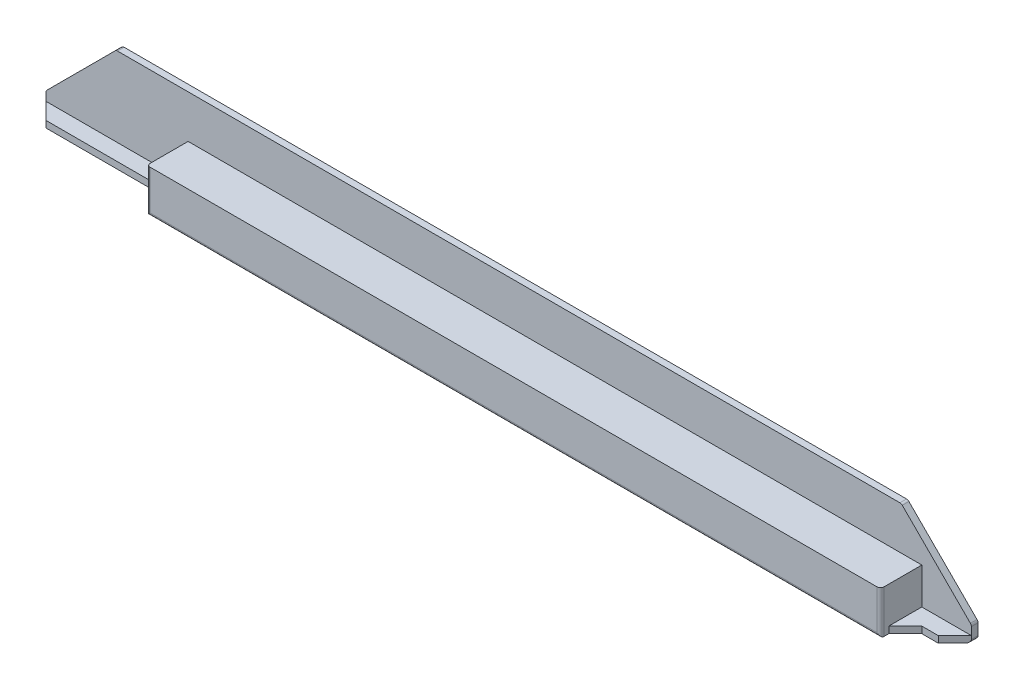
ISO-10303-21;
HEADER;
FILE_DESCRIPTION(('STEP AP214'),'2;1');
FILE_NAME('part.step','',(''),(''),'','','');
FILE_SCHEMA(('AUTOMOTIVE_DESIGN { 1 0 10303 214 1 1 1 1 }'));
ENDSEC;
DATA;
#1=APPLICATION_CONTEXT('core data for automotive mechanical design processes');
#2=APPLICATION_PROTOCOL_DEFINITION('international standard','automotive_design',2000,#1);
#3=PRODUCT_CONTEXT('',#1,'mechanical');
#4=PRODUCT('Part','Part','',(#3));
#5=PRODUCT_RELATED_PRODUCT_CATEGORY('part','',(#4));
#6=PRODUCT_DEFINITION_FORMATION('','',#4);
#7=PRODUCT_DEFINITION_CONTEXT('part definition',#1,'design');
#8=PRODUCT_DEFINITION('design','',#6,#7);
#9=PRODUCT_DEFINITION_SHAPE('','',#8);
#10=(LENGTH_UNIT() NAMED_UNIT(*) SI_UNIT(.MILLI.,.METRE.));
#11=(NAMED_UNIT(*) PLANE_ANGLE_UNIT() SI_UNIT($,.RADIAN.));
#12=(NAMED_UNIT(*) SI_UNIT($,.STERADIAN.) SOLID_ANGLE_UNIT());
#13=UNCERTAINTY_MEASURE_WITH_UNIT(LENGTH_MEASURE(1.E-05),#10,'distance_accuracy_value','');
#14=(GEOMETRIC_REPRESENTATION_CONTEXT(3) GLOBAL_UNCERTAINTY_ASSIGNED_CONTEXT((#13)) GLOBAL_UNIT_ASSIGNED_CONTEXT((#10,
#11,#12)) REPRESENTATION_CONTEXT('',''));
#15=CARTESIAN_POINT('',(0.,0.,0.));
#16=DIRECTION('',(0.,0.,1.));
#17=DIRECTION('',(1.,0.,0.));
#18=AXIS2_PLACEMENT_3D('',#15,#16,#17);
#19=CARTESIAN_POINT('',(0.,0.,2.));
#20=DIRECTION('',(0.,0.,1.));
#21=DIRECTION('',(1.,0.,0.));
#22=AXIS2_PLACEMENT_3D('',#19,#20,#21);
#23=PLANE('',#22);
#24=DIRECTION('',(-0.70710678118655,0.707106781186545,0.));
#25=VECTOR('',#24,1.);
#26=CARTESIAN_POINT('',(141.393398282201,141.393398282202,2.));
#27=LINE('',#26,#25);
#28=CARTESIAN_POINT('',(279.707106781187,3.07968978321713,2.));
#29=VERTEX_POINT('',#28);
#30=CARTESIAN_POINT('',(259.079689783217,23.7071067811865,2.));
#31=VERTEX_POINT('',#30);
#32=EDGE_CURVE('E268',#29,#31,#27,.T.);
#33=ORIENTED_EDGE('',*,*,#32,.T.);
#34=CARTESIAN_POINT('',(258.37258300203,23.,2.));
#35=DIRECTION('',(0.,0.,1.));
#36=DIRECTION('',(1.,0.,0.));
#37=AXIS2_PLACEMENT_3D('',#34,#35,#36);
#38=CIRCLE('',#37,1.);
#39=CARTESIAN_POINT('',(258.37258300203,24.,2.));
#40=VERTEX_POINT('',#39);
#41=EDGE_CURVE('E412',#31,#40,#38,.T.);
#42=ORIENTED_EDGE('',*,*,#41,.T.);
#43=DIRECTION('',(1.,0.,0.));
#44=VECTOR('',#43,1.);
#45=CARTESIAN_POINT('',(0.,24.,2.));
#46=LINE('',#45,#44);
#47=CARTESIAN_POINT('',(21.6274169979695,24.,2.));
#48=VERTEX_POINT('',#47);
#49=EDGE_CURVE('E271',#48,#40,#46,.T.);
#50=ORIENTED_EDGE('',*,*,#49,.F.);
#51=CARTESIAN_POINT('',(21.6274169979695,23.,2.));
#52=DIRECTION('',(0.,0.,1.));
#53=DIRECTION('',(1.,0.,0.));
#54=AXIS2_PLACEMENT_3D('',#51,#52,#53);
#55=CIRCLE('',#54,1.);
#56=CARTESIAN_POINT('',(20.920310216783,23.7071067811865,2.));
#57=VERTEX_POINT('',#56);
#58=EDGE_CURVE('E404',#48,#57,#55,.T.);
#59=ORIENTED_EDGE('',*,*,#58,.T.);
#60=DIRECTION('',(0.707106781186549,0.707106781186546,0.));
#61=VECTOR('',#60,1.);
#62=CARTESIAN_POINT('',(-1.39339828220181,1.39339828220181,2.));
#63=LINE('',#62,#61);
#64=CARTESIAN_POINT('',(0.292893218813454,3.07968978321706,2.));
#65=VERTEX_POINT('',#64);
#66=EDGE_CURVE('E275',#65,#57,#63,.T.);
#67=ORIENTED_EDGE('',*,*,#66,.F.);
#68=CARTESIAN_POINT('',(1.,2.37258300203052,2.));
#69=DIRECTION('',(0.,0.,1.));
#70=DIRECTION('',(1.,0.,0.));
#71=AXIS2_PLACEMENT_3D('',#68,#69,#70);
#72=CIRCLE('',#71,1.);
#73=CARTESIAN_POINT('',(0.,2.37258300203052,2.));
#74=VERTEX_POINT('',#73);
#75=EDGE_CURVE('E251',#65,#74,#72,.T.);
#76=ORIENTED_EDGE('',*,*,#75,.T.);
#77=DIRECTION('',(0.,1.,0.));
#78=VECTOR('',#77,1.);
#79=CARTESIAN_POINT('',(0.,0.,2.));
#80=LINE('',#79,#78);
#81=CARTESIAN_POINT('',(0.,0.,2.));
#82=VERTEX_POINT('',#81);
#83=EDGE_CURVE('E217',#82,#74,#80,.T.);
#84=ORIENTED_EDGE('',*,*,#83,.F.);
#85=DIRECTION('',(1.,0.,0.));
#86=VECTOR('',#85,1.);
#87=CARTESIAN_POINT('',(0.,0.,2.));
#88=LINE('',#87,#86);
#89=CARTESIAN_POINT('',(43.,0.,2.));
#90=VERTEX_POINT('',#89);
#91=EDGE_CURVE('E237',#82,#90,#88,.T.);
#92=ORIENTED_EDGE('',*,*,#91,.T.);
#93=DIRECTION('',(0.,-1.,0.));
#94=VECTOR('',#93,1.);
#95=CARTESIAN_POINT('',(43.,11.,2.));
#96=LINE('',#95,#94);
#97=CARTESIAN_POINT('',(43.,11.,2.));
#98=VERTEX_POINT('',#97);
#99=EDGE_CURVE('E442',#98,#90,#96,.T.);
#100=ORIENTED_EDGE('',*,*,#99,.F.);
#101=DIRECTION('',(-1.,0.,0.));
#102=VECTOR('',#101,1.);
#103=CARTESIAN_POINT('',(43.,11.,2.));
#104=LINE('',#103,#102);
#105=CARTESIAN_POINT('',(265.,11.,2.));
#106=VERTEX_POINT('',#105);
#107=EDGE_CURVE('E452',#106,#98,#104,.T.);
#108=ORIENTED_EDGE('',*,*,#107,.F.);
#109=DIRECTION('',(0.,1.,0.));
#110=VECTOR('',#109,1.);
#111=CARTESIAN_POINT('',(265.,11.,2.));
#112=LINE('',#111,#110);
#113=CARTESIAN_POINT('',(265.,0.,2.));
#114=VERTEX_POINT('',#113);
#115=EDGE_CURVE('E447',#114,#106,#112,.T.);
#116=ORIENTED_EDGE('',*,*,#115,.F.);
#117=CARTESIAN_POINT('',(280.,0.,2.));
#118=VERTEX_POINT('',#117);
#119=EDGE_CURVE('E246',#114,#118,#88,.T.);
#120=ORIENTED_EDGE('',*,*,#119,.T.);
#121=DIRECTION('',(0.,1.,0.));
#122=VECTOR('',#121,1.);
#123=CARTESIAN_POINT('',(280.,0.,2.));
#124=LINE('',#123,#122);
#125=CARTESIAN_POINT('',(280.,2.37258300203058,2.));
#126=VERTEX_POINT('',#125);
#127=EDGE_CURVE('E245',#118,#126,#124,.T.);
#128=ORIENTED_EDGE('',*,*,#127,.T.);
#129=CARTESIAN_POINT('',(279.,2.37258300203058,2.));
#130=DIRECTION('',(0.,0.,1.));
#131=DIRECTION('',(1.,0.,0.));
#132=AXIS2_PLACEMENT_3D('',#129,#130,#131);
#133=CIRCLE('',#132,1.);
#134=EDGE_CURVE('E409',#126,#29,#133,.T.);
#135=ORIENTED_EDGE('',*,*,#134,.T.);
#136=EDGE_LOOP('',(#33,#42,#50,#59,#67,#76,#84,#92,#100,#108,#116,#120,#128,#135));
#137=FACE_BOUND('',#136,.T.);
#138=ADVANCED_FACE('F43',(#137),#23,.T.);
#139=CARTESIAN_POINT('',(0.,0.,0.));
#140=DIRECTION('',(0.,1.,0.));
#141=DIRECTION('',(0.,0.,1.));
#142=AXIS2_PLACEMENT_3D('',#139,#140,#141);
#143=PLANE('',#142);
#144=ORIENTED_EDGE('',*,*,#91,.F.);
#145=DIRECTION('',(0.707106781186548,0.,0.707106781186547));
#146=VECTOR('',#145,1.);
#147=CARTESIAN_POINT('',(-1.,0.,1.));
#148=LINE('',#147,#146);
#149=CARTESIAN_POINT('',(5.,0.,7.));
#150=VERTEX_POINT('',#149);
#151=EDGE_CURVE('E222',#82,#150,#148,.T.);
#152=ORIENTED_EDGE('',*,*,#151,.T.);
#153=DIRECTION('',(-1.,0.,0.));
#154=VECTOR('',#153,1.);
#155=CARTESIAN_POINT('',(0.,0.,7.));
#156=LINE('',#155,#154);
#157=CARTESIAN_POINT('',(38.,0.,7.));
#158=VERTEX_POINT('',#157);
#159=EDGE_CURVE('E477',#158,#150,#156,.T.);
#160=ORIENTED_EDGE('',*,*,#159,.F.);
#161=DIRECTION('',(-0.707106781186546,0.,-0.707106781186549));
#162=VECTOR('',#161,1.);
#163=CARTESIAN_POINT('',(43.,0.,12.));
#164=LINE('',#163,#162);
#165=CARTESIAN_POINT('',(43.,0.,12.));
#166=VERTEX_POINT('',#165);
#167=EDGE_CURVE('E329',#158,#166,#164,.F.);
#168=ORIENTED_EDGE('',*,*,#167,.T.);
#169=DIRECTION('',(0.,0.,-1.));
#170=VECTOR('',#169,1.);
#171=CARTESIAN_POINT('',(43.,0.,0.));
#172=LINE('',#171,#170);
#173=EDGE_CURVE('E240',#166,#90,#172,.T.);
#174=ORIENTED_EDGE('',*,*,#173,.T.);
#175=EDGE_LOOP('',(#144,#152,#160,#168,#174));
#176=FACE_BOUND('',#175,.T.);
#177=ADVANCED_FACE('F238',(#176),#143,.T.);
#178=CARTESIAN_POINT('',(275.,0.,7.));
#179=VERTEX_POINT('',#178);
#180=CARTESIAN_POINT('',(270.,0.,7.));
#181=VERTEX_POINT('',#180);
#182=EDGE_CURVE('E262',#179,#181,#156,.T.);
#183=ORIENTED_EDGE('',*,*,#182,.F.);
#184=DIRECTION('',(-0.707106781186552,0.,0.707106781186543));
#185=VECTOR('',#184,1.);
#186=CARTESIAN_POINT('',(140.999999999998,0.,141.));
#187=LINE('',#186,#185);
#188=EDGE_CURVE('E316',#179,#118,#187,.F.);
#189=ORIENTED_EDGE('',*,*,#188,.T.);
#190=ORIENTED_EDGE('',*,*,#119,.F.);
#191=DIRECTION('',(0.,0.,1.));
#192=VECTOR('',#191,1.);
#193=CARTESIAN_POINT('',(265.,0.,0.));
#194=LINE('',#193,#192);
#195=CARTESIAN_POINT('',(265.,0.,12.));
#196=VERTEX_POINT('',#195);
#197=EDGE_CURVE('E472',#114,#196,#194,.T.);
#198=ORIENTED_EDGE('',*,*,#197,.T.);
#199=DIRECTION('',(-0.707106781186548,0.,0.707106781186547));
#200=VECTOR('',#199,1.);
#201=CARTESIAN_POINT('',(265.,0.,12.));
#202=LINE('',#201,#200);
#203=EDGE_CURVE('E332',#196,#181,#202,.F.);
#204=ORIENTED_EDGE('',*,*,#203,.T.);
#205=EDGE_LOOP('',(#183,#189,#190,#198,#204));
#206=FACE_BOUND('',#205,.T.);
#207=ADVANCED_FACE('F514',(#206),#143,.T.);
#208=CARTESIAN_POINT('',(0.,-2.,7.));
#209=DIRECTION('',(0.,0.,-1.));
#210=DIRECTION('',(-1.,0.,0.));
#211=AXIS2_PLACEMENT_3D('',#208,#209,#210);
#212=PLANE('',#211);
#213=DIRECTION('',(-1.,0.,0.));
#214=VECTOR('',#213,1.);
#215=CARTESIAN_POINT('',(0.,-2.,7.));
#216=LINE('',#215,#214);
#217=CARTESIAN_POINT('',(38.,-2.,7.));
#218=VERTEX_POINT('',#217);
#219=CARTESIAN_POINT('',(5.,-2.,7.));
#220=VERTEX_POINT('',#219);
#221=EDGE_CURVE('E481',#218,#220,#216,.T.);
#222=ORIENTED_EDGE('',*,*,#221,.F.);
#223=DIRECTION('',(0.,1.,0.));
#224=VECTOR('',#223,1.);
#225=CARTESIAN_POINT('',(38.,0.,7.));
#226=LINE('',#225,#224);
#227=EDGE_CURVE('E223',#218,#158,#226,.T.);
#228=ORIENTED_EDGE('',*,*,#227,.T.);
#229=ORIENTED_EDGE('',*,*,#159,.T.);
#230=DIRECTION('',(0.,-1.,0.));
#231=VECTOR('',#230,1.);
#232=CARTESIAN_POINT('',(5.,-2.,7.));
#233=LINE('',#232,#231);
#234=EDGE_CURVE('E229',#150,#220,#233,.T.);
#235=ORIENTED_EDGE('',*,*,#234,.T.);
#236=EDGE_LOOP('',(#222,#228,#229,#235));
#237=FACE_BOUND('',#236,.T.);
#238=ADVANCED_FACE('F519',(#237),#212,.F.);
#239=CARTESIAN_POINT('',(275.,-2.,7.));
#240=VERTEX_POINT('',#239);
#241=CARTESIAN_POINT('',(270.,-2.,7.));
#242=VERTEX_POINT('',#241);
#243=EDGE_CURVE('E285',#240,#242,#216,.T.);
#244=ORIENTED_EDGE('',*,*,#243,.F.);
#245=DIRECTION('',(0.,1.,0.));
#246=VECTOR('',#245,1.);
#247=CARTESIAN_POINT('',(275.,-2.,7.));
#248=LINE('',#247,#246);
#249=EDGE_CURVE('E312',#240,#179,#248,.T.);
#250=ORIENTED_EDGE('',*,*,#249,.T.);
#251=ORIENTED_EDGE('',*,*,#182,.T.);
#252=DIRECTION('',(0.,-1.,0.));
#253=VECTOR('',#252,1.);
#254=CARTESIAN_POINT('',(270.,-2.,7.));
#255=LINE('',#254,#253);
#256=EDGE_CURVE('E309',#181,#242,#255,.T.);
#257=ORIENTED_EDGE('',*,*,#256,.T.);
#258=EDGE_LOOP('',(#244,#250,#251,#257));
#259=FACE_BOUND('',#258,.T.);
#260=ADVANCED_FACE('F511',(#259),#212,.F.);
#261=CARTESIAN_POINT('',(0.,0.,2.));
#262=DIRECTION('',(-1.,0.,0.));
#263=DIRECTION('',(0.,0.,1.));
#264=AXIS2_PLACEMENT_3D('',#261,#262,#263);
#265=PLANE('',#264);
#266=ORIENTED_EDGE('',*,*,#83,.T.);
#267=DIRECTION('',(0.,0.,-1.));
#268=VECTOR('',#267,1.);
#269=CARTESIAN_POINT('',(0.,2.37258300203052,2.));
#270=LINE('',#269,#268);
#271=CARTESIAN_POINT('',(0.,2.37258300203052,0.));
#272=VERTEX_POINT('',#271);
#273=EDGE_CURVE('E425',#74,#272,#270,.T.);
#274=ORIENTED_EDGE('',*,*,#273,.T.);
#275=DIRECTION('',(0.,1.,0.));
#276=VECTOR('',#275,1.);
#277=CARTESIAN_POINT('',(0.,0.,0.));
#278=LINE('',#277,#276);
#279=CARTESIAN_POINT('',(0.,-1.,0.));
#280=VERTEX_POINT('',#279);
#281=EDGE_CURVE('E280',#280,#272,#278,.T.);
#282=ORIENTED_EDGE('',*,*,#281,.F.);
#283=DIRECTION('',(0.,0.,-1.));
#284=VECTOR('',#283,1.);
#285=CARTESIAN_POINT('',(0.,-1.,2.));
#286=LINE('',#285,#284);
#287=CARTESIAN_POINT('',(0.,-1.,2.));
#288=VERTEX_POINT('',#287);
#289=EDGE_CURVE('E61',#280,#288,#286,.F.);
#290=ORIENTED_EDGE('',*,*,#289,.T.);
#291=DIRECTION('',(0.,1.,0.));
#292=VECTOR('',#291,1.);
#293=CARTESIAN_POINT('',(0.,0.,2.));
#294=LINE('',#293,#292);
#295=EDGE_CURVE('E212',#288,#82,#294,.T.);
#296=ORIENTED_EDGE('',*,*,#295,.T.);
#297=EDGE_LOOP('',(#266,#274,#282,#290,#296));
#298=FACE_BOUND('',#297,.T.);
#299=ADVANCED_FACE('F214',(#298),#265,.T.);
#300=CARTESIAN_POINT('',(280.,0.,2.));
#301=DIRECTION('',(-1.,0.,0.));
#302=DIRECTION('',(0.,0.,1.));
#303=AXIS2_PLACEMENT_3D('',#300,#301,#302);
#304=PLANE('',#303);
#305=DIRECTION('',(0.,1.,0.));
#306=VECTOR('',#305,1.);
#307=CARTESIAN_POINT('',(280.,0.,0.));
#308=LINE('',#307,#306);
#309=CARTESIAN_POINT('',(280.,-1.,0.));
#310=VERTEX_POINT('',#309);
#311=CARTESIAN_POINT('',(280.,2.37258300203058,0.));
#312=VERTEX_POINT('',#311);
#313=EDGE_CURVE('E284',#310,#312,#308,.T.);
#314=ORIENTED_EDGE('',*,*,#313,.T.);
#315=DIRECTION('',(0.,0.,-1.));
#316=VECTOR('',#315,1.);
#317=CARTESIAN_POINT('',(280.,2.37258300203058,2.));
#318=LINE('',#317,#316);
#319=EDGE_CURVE('E418',#312,#126,#318,.F.);
#320=ORIENTED_EDGE('',*,*,#319,.T.);
#321=ORIENTED_EDGE('',*,*,#127,.F.);
#322=DIRECTION('',(0.,-1.,0.));
#323=VECTOR('',#322,1.);
#324=CARTESIAN_POINT('',(280.,0.,2.));
#325=LINE('',#324,#323);
#326=CARTESIAN_POINT('',(280.,-1.,2.));
#327=VERTEX_POINT('',#326);
#328=EDGE_CURVE('E319',#118,#327,#325,.T.);
#329=ORIENTED_EDGE('',*,*,#328,.T.);
#330=DIRECTION('',(0.,0.,1.));
#331=VECTOR('',#330,1.);
#332=CARTESIAN_POINT('',(280.,-1.,2.));
#333=LINE('',#332,#331);
#334=EDGE_CURVE('E415',#327,#310,#333,.F.);
#335=ORIENTED_EDGE('',*,*,#334,.T.);
#336=EDGE_LOOP('',(#314,#320,#321,#329,#335));
#337=FACE_BOUND('',#336,.T.);
#338=ADVANCED_FACE('F553',(#337),#304,.F.);
#339=CARTESIAN_POINT('',(141.393398282201,141.393398282202,2.));
#340=DIRECTION('',(-0.707106781186545,-0.70710678118655,0.));
#341=DIRECTION('',(0.70710678118655,-0.707106781186545,0.));
#342=AXIS2_PLACEMENT_3D('',#339,#340,#341);
#343=PLANE('',#342);
#344=DIRECTION('',(-0.70710678118655,0.707106781186545,0.));
#345=VECTOR('',#344,1.);
#346=CARTESIAN_POINT('',(141.393398282201,141.393398282202,0.));
#347=LINE('',#346,#345);
#348=CARTESIAN_POINT('',(279.707106781187,3.07968978321713,0.));
#349=VERTEX_POINT('',#348);
#350=CARTESIAN_POINT('',(259.079689783217,23.7071067811865,0.));
#351=VERTEX_POINT('',#350);
#352=EDGE_CURVE('E289',#349,#351,#347,.T.);
#353=ORIENTED_EDGE('',*,*,#352,.T.);
#354=DIRECTION('',(0.,0.,-1.));
#355=VECTOR('',#354,1.);
#356=CARTESIAN_POINT('',(259.079689783217,23.7071067811865,2.));
#357=LINE('',#356,#355);
#358=EDGE_CURVE('E401',#351,#31,#357,.F.);
#359=ORIENTED_EDGE('',*,*,#358,.T.);
#360=ORIENTED_EDGE('',*,*,#32,.F.);
#361=DIRECTION('',(0.,0.,-1.));
#362=VECTOR('',#361,1.);
#363=CARTESIAN_POINT('',(279.707106781186,3.07968978321715,2.));
#364=LINE('',#363,#362);
#365=EDGE_CURVE('E397',#29,#349,#364,.T.);
#366=ORIENTED_EDGE('',*,*,#365,.T.);
#367=EDGE_LOOP('',(#353,#359,#360,#366));
#368=FACE_BOUND('',#367,.T.);
#369=ADVANCED_FACE('F561',(#368),#343,.F.);
#370=CARTESIAN_POINT('',(0.,24.,2.));
#371=DIRECTION('',(0.,1.,0.));
#372=DIRECTION('',(0.,0.,1.));
#373=AXIS2_PLACEMENT_3D('',#370,#371,#372);
#374=PLANE('',#373);
#375=ORIENTED_EDGE('',*,*,#49,.T.);
#376=DIRECTION('',(0.,0.,-1.));
#377=VECTOR('',#376,1.);
#378=CARTESIAN_POINT('',(258.37258300203,24.,0.));
#379=LINE('',#378,#377);
#380=CARTESIAN_POINT('',(258.37258300203,24.,0.));
#381=VERTEX_POINT('',#380);
#382=EDGE_CURVE('E375',#40,#381,#379,.T.);
#383=ORIENTED_EDGE('',*,*,#382,.T.);
#384=DIRECTION('',(1.,0.,0.));
#385=VECTOR('',#384,1.);
#386=CARTESIAN_POINT('',(0.,24.,0.));
#387=LINE('',#386,#385);
#388=CARTESIAN_POINT('',(21.6274169979695,24.,0.));
#389=VERTEX_POINT('',#388);
#390=EDGE_CURVE('E259',#389,#381,#387,.T.);
#391=ORIENTED_EDGE('',*,*,#390,.F.);
#392=DIRECTION('',(0.,0.,-1.));
#393=VECTOR('',#392,1.);
#394=CARTESIAN_POINT('',(21.6274169979695,24.,2.));
#395=LINE('',#394,#393);
#396=EDGE_CURVE('E372',#389,#48,#395,.F.);
#397=ORIENTED_EDGE('',*,*,#396,.T.);
#398=EDGE_LOOP('',(#375,#383,#391,#397));
#399=FACE_BOUND('',#398,.T.);
#400=ADVANCED_FACE('F570',(#399),#374,.T.);
#401=CARTESIAN_POINT('',(-1.39339828220181,1.39339828220181,2.));
#402=DIRECTION('',(-0.707106781186546,0.707106781186549,0.));
#403=DIRECTION('',(-0.707106781186549,-0.707106781186546,0.));
#404=AXIS2_PLACEMENT_3D('',#401,#402,#403);
#405=PLANE('',#404);
#406=DIRECTION('',(0.707106781186549,0.707106781186546,0.));
#407=VECTOR('',#406,1.);
#408=CARTESIAN_POINT('',(-1.39339828220181,1.39339828220181,0.));
#409=LINE('',#408,#407);
#410=CARTESIAN_POINT('',(0.292893218813454,3.07968978321706,0.));
#411=VERTEX_POINT('',#410);
#412=CARTESIAN_POINT('',(20.920310216783,23.7071067811865,0.));
#413=VERTEX_POINT('',#412);
#414=EDGE_CURVE('E253',#411,#413,#409,.T.);
#415=ORIENTED_EDGE('',*,*,#414,.F.);
#416=DIRECTION('',(0.,0.,-1.));
#417=VECTOR('',#416,1.);
#418=CARTESIAN_POINT('',(0.292893218813453,3.07968978321706,2.));
#419=LINE('',#418,#417);
#420=EDGE_CURVE('E53',#411,#65,#419,.F.);
#421=ORIENTED_EDGE('',*,*,#420,.T.);
#422=ORIENTED_EDGE('',*,*,#66,.T.);
#423=DIRECTION('',(0.,0.,-1.));
#424=VECTOR('',#423,1.);
#425=CARTESIAN_POINT('',(20.920310216783,23.7071067811865,2.));
#426=LINE('',#425,#424);
#427=EDGE_CURVE('E428',#57,#413,#426,.T.);
#428=ORIENTED_EDGE('',*,*,#427,.T.);
#429=EDGE_LOOP('',(#415,#421,#422,#428));
#430=FACE_BOUND('',#429,.T.);
#431=ADVANCED_FACE('F578',(#430),#405,.T.);
#432=CARTESIAN_POINT('',(0.,0.,0.));
#433=DIRECTION('',(0.,0.,1.));
#434=DIRECTION('',(1.,0.,0.));
#435=AXIS2_PLACEMENT_3D('',#432,#433,#434);
#436=PLANE('',#435);
#437=ORIENTED_EDGE('',*,*,#390,.T.);
#438=CARTESIAN_POINT('',(258.37258300203,23.,0.));
#439=DIRECTION('',(0.,0.,1.));
#440=DIRECTION('',(1.,0.,0.));
#441=AXIS2_PLACEMENT_3D('',#438,#439,#440);
#442=CIRCLE('',#441,1.);
#443=EDGE_CURVE('E394',#381,#351,#442,.F.);
#444=ORIENTED_EDGE('',*,*,#443,.T.);
#445=ORIENTED_EDGE('',*,*,#352,.F.);
#446=CARTESIAN_POINT('',(279.,2.37258300203058,0.));
#447=DIRECTION('',(0.,0.,1.));
#448=DIRECTION('',(1.,0.,0.));
#449=AXIS2_PLACEMENT_3D('',#446,#447,#448);
#450=CIRCLE('',#449,1.);
#451=EDGE_CURVE('E391',#349,#312,#450,.F.);
#452=ORIENTED_EDGE('',*,*,#451,.T.);
#453=ORIENTED_EDGE('',*,*,#313,.F.);
#454=CARTESIAN_POINT('',(279.,-1.,0.));
#455=DIRECTION('',(0.,0.,1.));
#456=DIRECTION('',(1.,0.,0.));
#457=AXIS2_PLACEMENT_3D('',#454,#455,#456);
#458=CIRCLE('',#457,1.);
#459=CARTESIAN_POINT('',(279.,-2.,0.));
#460=VERTEX_POINT('',#459);
#461=EDGE_CURVE('E388',#310,#460,#458,.F.);
#462=ORIENTED_EDGE('',*,*,#461,.T.);
#463=DIRECTION('',(1.,0.,0.));
#464=VECTOR('',#463,1.);
#465=CARTESIAN_POINT('',(0.,-2.,0.));
#466=LINE('',#465,#464);
#467=CARTESIAN_POINT('',(1.,-2.,0.));
#468=VERTEX_POINT('',#467);
#469=EDGE_CURVE('E478',#468,#460,#466,.T.);
#470=ORIENTED_EDGE('',*,*,#469,.F.);
#471=CARTESIAN_POINT('',(1.,-1.,0.));
#472=DIRECTION('',(0.,0.,1.));
#473=DIRECTION('',(1.,0.,0.));
#474=AXIS2_PLACEMENT_3D('',#471,#472,#473);
#475=CIRCLE('',#474,1.);
#476=EDGE_CURVE('E379',#468,#280,#475,.F.);
#477=ORIENTED_EDGE('',*,*,#476,.T.);
#478=ORIENTED_EDGE('',*,*,#281,.T.);
#479=CARTESIAN_POINT('',(1.,2.37258300203052,0.));
#480=DIRECTION('',(0.,0.,1.));
#481=DIRECTION('',(1.,0.,0.));
#482=AXIS2_PLACEMENT_3D('',#479,#480,#481);
#483=CIRCLE('',#482,1.);
#484=EDGE_CURVE('E385',#272,#411,#483,.F.);
#485=ORIENTED_EDGE('',*,*,#484,.T.);
#486=ORIENTED_EDGE('',*,*,#414,.T.);
#487=CARTESIAN_POINT('',(21.6274169979695,23.,0.));
#488=DIRECTION('',(0.,0.,1.));
#489=DIRECTION('',(1.,0.,0.));
#490=AXIS2_PLACEMENT_3D('',#487,#488,#489);
#491=CIRCLE('',#490,1.);
#492=EDGE_CURVE('E382',#413,#389,#491,.F.);
#493=ORIENTED_EDGE('',*,*,#492,.T.);
#494=EDGE_LOOP('',(#437,#444,#445,#452,#453,#462,#470,#477,#478,#485,#486,#493));
#495=FACE_BOUND('',#494,.T.);
#496=ADVANCED_FACE('F500',(#495),#436,.F.);
#497=CARTESIAN_POINT('',(0.,-2.,0.));
#498=DIRECTION('',(0.,1.,0.));
#499=DIRECTION('',(0.,0.,1.));
#500=AXIS2_PLACEMENT_3D('',#497,#498,#499);
#501=PLANE('',#500);
#502=DIRECTION('',(0.,0.,-1.));
#503=VECTOR('',#502,1.);
#504=CARTESIAN_POINT('',(265.,-2.,14.5));
#505=LINE('',#504,#503);
#506=CARTESIAN_POINT('',(265.,-2.,13.5));
#507=VERTEX_POINT('',#506);
#508=CARTESIAN_POINT('',(265.,-2.,12.));
#509=VERTEX_POINT('',#508);
#510=EDGE_CURVE('E466',#507,#509,#505,.T.);
#511=ORIENTED_EDGE('',*,*,#510,.F.);
#512=DIRECTION('',(1.,0.,0.));
#513=VECTOR('',#512,1.);
#514=CARTESIAN_POINT('',(43.,-2.,13.5));
#515=LINE('',#514,#513);
#516=CARTESIAN_POINT('',(43.,-2.,13.5));
#517=VERTEX_POINT('',#516);
#518=EDGE_CURVE('E369',#507,#517,#515,.F.);
#519=ORIENTED_EDGE('',*,*,#518,.T.);
#520=DIRECTION('',(0.,0.,-1.));
#521=VECTOR('',#520,1.);
#522=CARTESIAN_POINT('',(43.,-2.,14.5));
#523=LINE('',#522,#521);
#524=CARTESIAN_POINT('',(43.,-2.,12.));
#525=VERTEX_POINT('',#524);
#526=EDGE_CURVE('E469',#517,#525,#523,.T.);
#527=ORIENTED_EDGE('',*,*,#526,.T.);
#528=DIRECTION('',(0.707106781186546,0.,0.707106781186549));
#529=VECTOR('',#528,1.);
#530=CARTESIAN_POINT('',(15.5000000000001,-2.,-15.5));
#531=LINE('',#530,#529);
#532=EDGE_CURVE('E326',#525,#218,#531,.F.);
#533=ORIENTED_EDGE('',*,*,#532,.T.);
#534=ORIENTED_EDGE('',*,*,#221,.T.);
#535=DIRECTION('',(-0.707106781186548,0.,-0.707106781186547));
#536=VECTOR('',#535,1.);
#537=CARTESIAN_POINT('',(0.,-2.,2.));
#538=LINE('',#537,#536);
#539=CARTESIAN_POINT('',(1.,-2.,3.));
#540=VERTEX_POINT('',#539);
#541=EDGE_CURVE('E305',#220,#540,#538,.T.);
#542=ORIENTED_EDGE('',*,*,#541,.T.);
#543=DIRECTION('',(0.,0.,-1.));
#544=VECTOR('',#543,1.);
#545=CARTESIAN_POINT('',(1.,-2.,0.));
#546=LINE('',#545,#544);
#547=EDGE_CURVE('E361',#540,#468,#546,.T.);
#548=ORIENTED_EDGE('',*,*,#547,.T.);
#549=ORIENTED_EDGE('',*,*,#469,.T.);
#550=DIRECTION('',(0.,0.,1.));
#551=VECTOR('',#550,1.);
#552=CARTESIAN_POINT('',(279.,-2.,0.));
#553=LINE('',#552,#551);
#554=CARTESIAN_POINT('',(279.,-2.,2.99999999999999));
#555=VERTEX_POINT('',#554);
#556=EDGE_CURVE('E365',#460,#555,#553,.T.);
#557=ORIENTED_EDGE('',*,*,#556,.T.);
#558=DIRECTION('',(0.707106781186552,0.,-0.707106781186543));
#559=VECTOR('',#558,1.);
#560=CARTESIAN_POINT('',(275.,-2.,7.));
#561=LINE('',#560,#559);
#562=EDGE_CURVE('E234',#555,#240,#561,.F.);
#563=ORIENTED_EDGE('',*,*,#562,.T.);
#564=ORIENTED_EDGE('',*,*,#243,.T.);
#565=DIRECTION('',(0.707106781186548,0.,-0.707106781186547));
#566=VECTOR('',#565,1.);
#567=CARTESIAN_POINT('',(138.5,-2.,138.5));
#568=LINE('',#567,#566);
#569=EDGE_CURVE('E335',#242,#509,#568,.F.);
#570=ORIENTED_EDGE('',*,*,#569,.T.);
#571=EDGE_LOOP('',(#511,#519,#527,#533,#534,#542,#548,#549,#557,#563,#564,#570));
#572=FACE_BOUND('',#571,.T.);
#573=ADVANCED_FACE('F491',(#572),#501,.F.);
#574=CARTESIAN_POINT('',(43.,11.,14.5));
#575=DIRECTION('',(1.,0.,0.));
#576=DIRECTION('',(0.,0.,-1.));
#577=AXIS2_PLACEMENT_3D('',#574,#575,#576);
#578=PLANE('',#577);
#579=ORIENTED_EDGE('',*,*,#526,.F.);
#580=DIRECTION('',(0.,-1.,0.));
#581=VECTOR('',#580,1.);
#582=CARTESIAN_POINT('',(43.,11.,13.5));
#583=LINE('',#582,#581);
#584=CARTESIAN_POINT('',(43.,11.,13.5));
#585=VERTEX_POINT('',#584);
#586=EDGE_CURVE('E349',#517,#585,#583,.F.);
#587=ORIENTED_EDGE('',*,*,#586,.T.);
#588=DIRECTION('',(0.,0.,-1.));
#589=VECTOR('',#588,1.);
#590=CARTESIAN_POINT('',(43.,11.,14.5));
#591=LINE('',#590,#589);
#592=EDGE_CURVE('E460',#585,#98,#591,.T.);
#593=ORIENTED_EDGE('',*,*,#592,.T.);
#594=ORIENTED_EDGE('',*,*,#99,.T.);
#595=ORIENTED_EDGE('',*,*,#173,.F.);
#596=DIRECTION('',(0.,-1.,0.));
#597=VECTOR('',#596,1.);
#598=CARTESIAN_POINT('',(43.,-2.,12.));
#599=LINE('',#598,#597);
#600=EDGE_CURVE('E279',#166,#525,#599,.T.);
#601=ORIENTED_EDGE('',*,*,#600,.T.);
#602=EDGE_LOOP('',(#579,#587,#593,#594,#595,#601));
#603=FACE_BOUND('',#602,.T.);
#604=ADVANCED_FACE('F525',(#603),#578,.F.);
#605=CARTESIAN_POINT('',(265.,11.,14.5));
#606=DIRECTION('',(-1.,0.,0.));
#607=DIRECTION('',(0.,0.,1.));
#608=AXIS2_PLACEMENT_3D('',#605,#606,#607);
#609=PLANE('',#608);
#610=DIRECTION('',(0.,0.,-1.));
#611=VECTOR('',#610,1.);
#612=CARTESIAN_POINT('',(265.,11.,14.5));
#613=LINE('',#612,#611);
#614=CARTESIAN_POINT('',(265.,11.,13.5));
#615=VERTEX_POINT('',#614);
#616=EDGE_CURVE('E463',#615,#106,#613,.T.);
#617=ORIENTED_EDGE('',*,*,#616,.F.);
#618=DIRECTION('',(0.,1.,0.));
#619=VECTOR('',#618,1.);
#620=CARTESIAN_POINT('',(265.,-2.,13.5));
#621=LINE('',#620,#619);
#622=EDGE_CURVE('E358',#615,#507,#621,.F.);
#623=ORIENTED_EDGE('',*,*,#622,.T.);
#624=ORIENTED_EDGE('',*,*,#510,.T.);
#625=DIRECTION('',(0.,1.,0.));
#626=VECTOR('',#625,1.);
#627=CARTESIAN_POINT('',(265.,0.,12.));
#628=LINE('',#627,#626);
#629=EDGE_CURVE('E322',#509,#196,#628,.T.);
#630=ORIENTED_EDGE('',*,*,#629,.T.);
#631=ORIENTED_EDGE('',*,*,#197,.F.);
#632=ORIENTED_EDGE('',*,*,#115,.T.);
#633=EDGE_LOOP('',(#617,#623,#624,#630,#631,#632));
#634=FACE_BOUND('',#633,.T.);
#635=ADVANCED_FACE('F544',(#634),#609,.F.);
#636=CARTESIAN_POINT('',(43.,11.,14.5));
#637=DIRECTION('',(0.,-1.,0.));
#638=DIRECTION('',(0.,0.,-1.));
#639=AXIS2_PLACEMENT_3D('',#636,#637,#638);
#640=PLANE('',#639);
#641=ORIENTED_EDGE('',*,*,#592,.F.);
#642=CARTESIAN_POINT('',(44.,11.,13.5));
#643=DIRECTION('',(0.,-1.,0.));
#644=DIRECTION('',(0.,0.,-1.));
#645=AXIS2_PLACEMENT_3D('',#642,#643,#644);
#646=CIRCLE('',#645,1.);
#647=CARTESIAN_POINT('',(44.,11.,14.5));
#648=VERTEX_POINT('',#647);
#649=EDGE_CURVE('E355',#585,#648,#646,.F.);
#650=ORIENTED_EDGE('',*,*,#649,.T.);
#651=DIRECTION('',(-1.,0.,0.));
#652=VECTOR('',#651,1.);
#653=CARTESIAN_POINT('',(43.,11.,14.5));
#654=LINE('',#653,#652);
#655=CARTESIAN_POINT('',(264.,11.,14.5));
#656=VERTEX_POINT('',#655);
#657=EDGE_CURVE('E455',#656,#648,#654,.T.);
#658=ORIENTED_EDGE('',*,*,#657,.F.);
#659=CARTESIAN_POINT('',(264.,11.,13.5));
#660=DIRECTION('',(0.,-1.,0.));
#661=DIRECTION('',(0.,0.,-1.));
#662=AXIS2_PLACEMENT_3D('',#659,#660,#661);
#663=CIRCLE('',#662,1.);
#664=EDGE_CURVE('E352',#656,#615,#663,.F.);
#665=ORIENTED_EDGE('',*,*,#664,.T.);
#666=ORIENTED_EDGE('',*,*,#616,.T.);
#667=ORIENTED_EDGE('',*,*,#107,.T.);
#668=EDGE_LOOP('',(#641,#650,#658,#665,#666,#667));
#669=FACE_BOUND('',#668,.T.);
#670=ADVANCED_FACE('F538',(#669),#640,.F.);
#671=CARTESIAN_POINT('',(0.,0.,14.5));
#672=DIRECTION('',(0.,0.,1.));
#673=DIRECTION('',(1.,0.,0.));
#674=AXIS2_PLACEMENT_3D('',#671,#672,#673);
#675=PLANE('',#674);
#676=ORIENTED_EDGE('',*,*,#657,.T.);
#677=DIRECTION('',(0.,-1.,0.));
#678=VECTOR('',#677,1.);
#679=CARTESIAN_POINT('',(44.,-2.,14.5));
#680=LINE('',#679,#678);
#681=CARTESIAN_POINT('',(44.,-1.,14.5));
#682=VERTEX_POINT('',#681);
#683=EDGE_CURVE('E345',#648,#682,#680,.T.);
#684=ORIENTED_EDGE('',*,*,#683,.T.);
#685=DIRECTION('',(1.,0.,0.));
#686=VECTOR('',#685,1.);
#687=CARTESIAN_POINT('',(265.,-1.,14.5));
#688=LINE('',#687,#686);
#689=CARTESIAN_POINT('',(264.,-1.,14.5));
#690=VERTEX_POINT('',#689);
#691=EDGE_CURVE('E339',#682,#690,#688,.T.);
#692=ORIENTED_EDGE('',*,*,#691,.T.);
#693=DIRECTION('',(0.,1.,0.));
#694=VECTOR('',#693,1.);
#695=CARTESIAN_POINT('',(264.,11.,14.5));
#696=LINE('',#695,#694);
#697=EDGE_CURVE('E342',#690,#656,#696,.T.);
#698=ORIENTED_EDGE('',*,*,#697,.T.);
#699=EDGE_LOOP('',(#676,#684,#692,#698));
#700=FACE_BOUND('',#699,.T.);
#701=ADVANCED_FACE('F533',(#700),#675,.T.);
#702=CARTESIAN_POINT('',(43.,11.,12.));
#703=DIRECTION('',(-0.707106781186549,0.,0.707106781186546));
#704=DIRECTION('',(0.,1.,0.));
#705=AXIS2_PLACEMENT_3D('',#702,#703,#704);
#706=PLANE('',#705);
#707=ORIENTED_EDGE('',*,*,#167,.F.);
#708=ORIENTED_EDGE('',*,*,#227,.F.);
#709=ORIENTED_EDGE('',*,*,#532,.F.);
#710=ORIENTED_EDGE('',*,*,#600,.F.);
#711=EDGE_LOOP('',(#707,#708,#709,#710));
#712=FACE_BOUND('',#711,.T.);
#713=ADVANCED_FACE('F523',(#712),#706,.T.);
#714=CARTESIAN_POINT('',(0.,0.,2.));
#715=DIRECTION('',(-0.707106781186547,0.,0.707106781186548));
#716=DIRECTION('',(0.,-1.,0.));
#717=AXIS2_PLACEMENT_3D('',#714,#715,#716);
#718=PLANE('',#717);
#719=ORIENTED_EDGE('',*,*,#295,.F.);
#720=CARTESIAN_POINT('',(1.,-1.,3.));
#721=DIRECTION('',(-0.707106781186547,0.,0.707106781186548));
#722=DIRECTION('',(0.707106781186548,0.,0.707106781186547));
#723=AXIS2_PLACEMENT_3D('',#720,#721,#722);
#724=ELLIPSE('',#723,1.41421356237309,1.);
#725=EDGE_CURVE('E11',#288,#540,#724,.T.);
#726=ORIENTED_EDGE('',*,*,#725,.T.);
#727=ORIENTED_EDGE('',*,*,#541,.F.);
#728=ORIENTED_EDGE('',*,*,#234,.F.);
#729=ORIENTED_EDGE('',*,*,#151,.F.);
#730=EDGE_LOOP('',(#719,#726,#727,#728,#729));
#731=FACE_BOUND('',#730,.T.);
#732=ADVANCED_FACE('F227',(#731),#718,.T.);
#733=CARTESIAN_POINT('',(275.,-2.,7.));
#734=DIRECTION('',(-0.707106781186543,0.,-0.707106781186552));
#735=DIRECTION('',(0.,1.,0.));
#736=AXIS2_PLACEMENT_3D('',#733,#734,#735);
#737=PLANE('',#736);
#738=ORIENTED_EDGE('',*,*,#562,.F.);
#739=CARTESIAN_POINT('',(279.,-1.,2.99999999999999));
#740=DIRECTION('',(-0.707106781186543,0.,-0.707106781186552));
#741=DIRECTION('',(-0.707106781186552,0.,0.707106781186543));
#742=AXIS2_PLACEMENT_3D('',#739,#740,#741);
#743=ELLIPSE('',#742,1.41421356237309,1.);
#744=EDGE_CURVE('E69',#555,#327,#743,.F.);
#745=ORIENTED_EDGE('',*,*,#744,.T.);
#746=ORIENTED_EDGE('',*,*,#328,.F.);
#747=ORIENTED_EDGE('',*,*,#188,.F.);
#748=ORIENTED_EDGE('',*,*,#249,.F.);
#749=EDGE_LOOP('',(#738,#745,#746,#747,#748));
#750=FACE_BOUND('',#749,.T.);
#751=ADVANCED_FACE('F507',(#750),#737,.F.);
#752=CARTESIAN_POINT('',(265.,11.,12.));
#753=DIRECTION('',(0.707106781186547,0.,0.707106781186548));
#754=DIRECTION('',(0.,-1.,0.));
#755=AXIS2_PLACEMENT_3D('',#752,#753,#754);
#756=PLANE('',#755);
#757=ORIENTED_EDGE('',*,*,#569,.F.);
#758=ORIENTED_EDGE('',*,*,#256,.F.);
#759=ORIENTED_EDGE('',*,*,#203,.F.);
#760=ORIENTED_EDGE('',*,*,#629,.F.);
#761=EDGE_LOOP('',(#757,#758,#759,#760));
#762=FACE_BOUND('',#761,.T.);
#763=ADVANCED_FACE('F547',(#762),#756,.T.);
#764=CARTESIAN_POINT('',(264.,0.,13.5));
#765=DIRECTION('',(0.,-1.,0.));
#766=DIRECTION('',(0.,0.,-1.));
#767=AXIS2_PLACEMENT_3D('',#764,#765,#766);
#768=CYLINDRICAL_SURFACE('',#767,1.);
#769=ORIENTED_EDGE('',*,*,#664,.F.);
#770=ORIENTED_EDGE('',*,*,#697,.F.);
#771=CARTESIAN_POINT('',(264.,-1.,13.5));
#772=DIRECTION('',(-0.707106781186547,-0.707106781186547,0.));
#773=DIRECTION('',(-0.707106781186547,0.707106781186547,0.));
#774=AXIS2_PLACEMENT_3D('',#771,#772,#773);
#775=ELLIPSE('',#774,1.41421356237309,1.);
#776=EDGE_CURVE('E47',#507,#690,#775,.T.);
#777=ORIENTED_EDGE('',*,*,#776,.F.);
#778=ORIENTED_EDGE('',*,*,#622,.F.);
#779=EDGE_LOOP('',(#769,#770,#777,#778));
#780=FACE_BOUND('',#779,.T.);
#781=ADVANCED_FACE('F542',(#780),#768,.T.);
#782=CARTESIAN_POINT('',(0.,-1.,13.5));
#783=DIRECTION('',(-1.,0.,0.));
#784=DIRECTION('',(0.,0.,1.));
#785=AXIS2_PLACEMENT_3D('',#782,#783,#784);
#786=CYLINDRICAL_SURFACE('',#785,1.);
#787=ORIENTED_EDGE('',*,*,#776,.T.);
#788=ORIENTED_EDGE('',*,*,#691,.F.);
#789=CARTESIAN_POINT('',(44.,-1.,13.5));
#790=DIRECTION('',(-0.707106781186547,0.707106781186547,0.));
#791=DIRECTION('',(-0.707106781186547,-0.707106781186547,0.));
#792=AXIS2_PLACEMENT_3D('',#789,#790,#791);
#793=ELLIPSE('',#792,1.41421356237309,1.);
#794=EDGE_CURVE('E433',#517,#682,#793,.T.);
#795=ORIENTED_EDGE('',*,*,#794,.F.);
#796=ORIENTED_EDGE('',*,*,#518,.F.);
#797=EDGE_LOOP('',(#787,#788,#795,#796));
#798=FACE_BOUND('',#797,.T.);
#799=ADVANCED_FACE('F529',(#798),#786,.T.);
#800=CARTESIAN_POINT('',(44.,0.,13.5));
#801=DIRECTION('',(0.,1.,0.));
#802=DIRECTION('',(0.,0.,1.));
#803=AXIS2_PLACEMENT_3D('',#800,#801,#802);
#804=CYLINDRICAL_SURFACE('',#803,1.);
#805=ORIENTED_EDGE('',*,*,#649,.F.);
#806=ORIENTED_EDGE('',*,*,#586,.F.);
#807=ORIENTED_EDGE('',*,*,#794,.T.);
#808=ORIENTED_EDGE('',*,*,#683,.F.);
#809=EDGE_LOOP('',(#805,#806,#807,#808));
#810=FACE_BOUND('',#809,.T.);
#811=ADVANCED_FACE('F528',(#810),#804,.T.);
#812=CARTESIAN_POINT('',(258.37258300203,23.,2.));
#813=DIRECTION('',(0.,0.,1.));
#814=DIRECTION('',(1.,0.,0.));
#815=AXIS2_PLACEMENT_3D('',#812,#813,#814);
#816=CYLINDRICAL_SURFACE('',#815,1.);
#817=ORIENTED_EDGE('',*,*,#41,.F.);
#818=ORIENTED_EDGE('',*,*,#358,.F.);
#819=ORIENTED_EDGE('',*,*,#443,.F.);
#820=ORIENTED_EDGE('',*,*,#382,.F.);
#821=EDGE_LOOP('',(#817,#818,#819,#820));
#822=FACE_BOUND('',#821,.T.);
#823=ADVANCED_FACE('F565',(#822),#816,.T.);
#824=CARTESIAN_POINT('',(279.,2.37258300203058,2.));
#825=DIRECTION('',(0.,0.,-1.));
#826=DIRECTION('',(-1.,0.,0.));
#827=AXIS2_PLACEMENT_3D('',#824,#825,#826);
#828=CYLINDRICAL_SURFACE('',#827,1.);
#829=ORIENTED_EDGE('',*,*,#134,.F.);
#830=ORIENTED_EDGE('',*,*,#319,.F.);
#831=ORIENTED_EDGE('',*,*,#451,.F.);
#832=ORIENTED_EDGE('',*,*,#365,.F.);
#833=EDGE_LOOP('',(#829,#830,#831,#832));
#834=FACE_BOUND('',#833,.T.);
#835=ADVANCED_FACE('F556',(#834),#828,.T.);
#836=CARTESIAN_POINT('',(279.,-1.,0.));
#837=DIRECTION('',(0.,0.,1.));
#838=DIRECTION('',(1.,0.,0.));
#839=AXIS2_PLACEMENT_3D('',#836,#837,#838);
#840=CYLINDRICAL_SURFACE('',#839,1.);
#841=ORIENTED_EDGE('',*,*,#461,.F.);
#842=ORIENTED_EDGE('',*,*,#334,.F.);
#843=ORIENTED_EDGE('',*,*,#744,.F.);
#844=ORIENTED_EDGE('',*,*,#556,.F.);
#845=EDGE_LOOP('',(#841,#842,#843,#844));
#846=FACE_BOUND('',#845,.T.);
#847=ADVANCED_FACE('F505',(#846),#840,.T.);
#848=CARTESIAN_POINT('',(1.,2.37258300203052,2.));
#849=DIRECTION('',(0.,0.,-1.));
#850=DIRECTION('',(-1.,0.,0.));
#851=AXIS2_PLACEMENT_3D('',#848,#849,#850);
#852=CYLINDRICAL_SURFACE('',#851,1.);
#853=ORIENTED_EDGE('',*,*,#75,.F.);
#854=ORIENTED_EDGE('',*,*,#420,.F.);
#855=ORIENTED_EDGE('',*,*,#484,.F.);
#856=ORIENTED_EDGE('',*,*,#273,.F.);
#857=EDGE_LOOP('',(#853,#854,#855,#856));
#858=FACE_BOUND('',#857,.T.);
#859=ADVANCED_FACE('F581',(#858),#852,.T.);
#860=CARTESIAN_POINT('',(21.6274169979695,23.,2.));
#861=DIRECTION('',(0.,0.,-1.));
#862=DIRECTION('',(-1.,0.,0.));
#863=AXIS2_PLACEMENT_3D('',#860,#861,#862);
#864=CYLINDRICAL_SURFACE('',#863,1.);
#865=ORIENTED_EDGE('',*,*,#58,.F.);
#866=ORIENTED_EDGE('',*,*,#396,.F.);
#867=ORIENTED_EDGE('',*,*,#492,.F.);
#868=ORIENTED_EDGE('',*,*,#427,.F.);
#869=EDGE_LOOP('',(#865,#866,#867,#868));
#870=FACE_BOUND('',#869,.T.);
#871=ADVANCED_FACE('F574',(#870),#864,.T.);
#872=CARTESIAN_POINT('',(1.,-1.,0.));
#873=DIRECTION('',(0.,0.,1.));
#874=DIRECTION('',(1.,0.,0.));
#875=AXIS2_PLACEMENT_3D('',#872,#873,#874);
#876=CYLINDRICAL_SURFACE('',#875,1.);
#877=ORIENTED_EDGE('',*,*,#725,.F.);
#878=ORIENTED_EDGE('',*,*,#289,.F.);
#879=ORIENTED_EDGE('',*,*,#476,.F.);
#880=ORIENTED_EDGE('',*,*,#547,.F.);
#881=EDGE_LOOP('',(#877,#878,#879,#880));
#882=FACE_BOUND('',#881,.T.);
#883=ADVANCED_FACE('F45',(#882),#876,.T.);
#884=CLOSED_SHELL('',(#138,#177,#207,#238,#260,#299,#338,#369,#400,#431,#496,#573,#604,#635,
#670,#701,#713,#732,#751,#763,#781,#799,#811,#823,#835,#847,#859,#871,#883));
#885=MANIFOLD_SOLID_BREP('B2',#884);
#886=ADVANCED_BREP_SHAPE_REPRESENTATION('',(#18,#885),#14);
#887=SHAPE_DEFINITION_REPRESENTATION(#9,#886);
ENDSEC;
END-ISO-10303-21;
